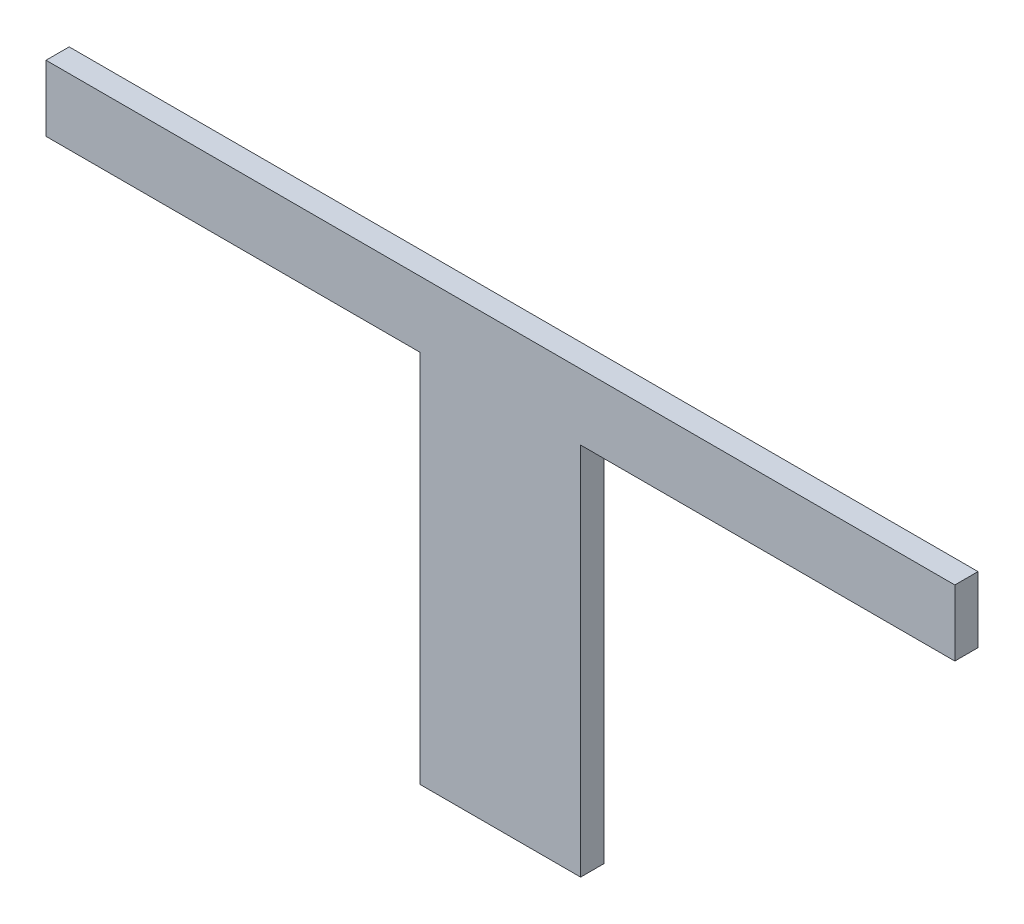
ISO-10303-21;
HEADER;
FILE_DESCRIPTION(('STEP AP214'),'2;1');
FILE_NAME('part.step','',(''),(''),'','','');
FILE_SCHEMA(('AUTOMOTIVE_DESIGN { 1 0 10303 214 1 1 1 1 }'));
ENDSEC;
DATA;
#1=APPLICATION_CONTEXT('core data for automotive mechanical design processes');
#2=APPLICATION_PROTOCOL_DEFINITION('international standard','automotive_design',2000,#1);
#3=PRODUCT_CONTEXT('',#1,'mechanical');
#4=PRODUCT('Part','Part','',(#3));
#5=PRODUCT_RELATED_PRODUCT_CATEGORY('part','',(#4));
#6=PRODUCT_DEFINITION_FORMATION('','',#4);
#7=PRODUCT_DEFINITION_CONTEXT('part definition',#1,'design');
#8=PRODUCT_DEFINITION('design','',#6,#7);
#9=PRODUCT_DEFINITION_SHAPE('','',#8);
#10=(LENGTH_UNIT() NAMED_UNIT(*) SI_UNIT(.MILLI.,.METRE.));
#11=(NAMED_UNIT(*) PLANE_ANGLE_UNIT() SI_UNIT($,.RADIAN.));
#12=(NAMED_UNIT(*) SI_UNIT($,.STERADIAN.) SOLID_ANGLE_UNIT());
#13=UNCERTAINTY_MEASURE_WITH_UNIT(LENGTH_MEASURE(1.E-05),#10,'distance_accuracy_value','');
#14=(GEOMETRIC_REPRESENTATION_CONTEXT(3) GLOBAL_UNCERTAINTY_ASSIGNED_CONTEXT((#13)) GLOBAL_UNIT_ASSIGNED_CONTEXT((#10,
#11,#12)) REPRESENTATION_CONTEXT('',''));
#15=CARTESIAN_POINT('',(0.,0.,0.));
#16=DIRECTION('',(0.,0.,1.));
#17=DIRECTION('',(1.,0.,0.));
#18=AXIS2_PLACEMENT_3D('',#15,#16,#17);
#19=CARTESIAN_POINT('',(1.73076923076924,-1.92307692307692,0.5));
#20=DIRECTION('',(0.,1.,0.));
#21=DIRECTION('',(0.,0.,1.));
#22=AXIS2_PLACEMENT_3D('',#19,#20,#21);
#23=PLANE('',#22);
#24=DIRECTION('',(1.,0.,0.));
#25=VECTOR('',#24,1.);
#26=CARTESIAN_POINT('',(1.73076923076924,-1.92307692307692,0.));
#27=LINE('',#26,#25);
#28=CARTESIAN_POINT('',(1.73076923076924,-1.92307692307692,0.));
#29=VERTEX_POINT('',#28);
#30=CARTESIAN_POINT('',(9.80769230769232,-1.92307692307692,0.));
#31=VERTEX_POINT('',#30);
#32=EDGE_CURVE('E135',#29,#31,#27,.T.);
#33=ORIENTED_EDGE('',*,*,#32,.T.);
#34=DIRECTION('',(0.,0.,-1.));
#35=VECTOR('',#34,1.);
#36=CARTESIAN_POINT('',(9.80769230769232,-1.92307692307692,0.5));
#37=LINE('',#36,#35);
#38=CARTESIAN_POINT('',(9.80769230769232,-1.92307692307692,0.5));
#39=VERTEX_POINT('',#38);
#40=EDGE_CURVE('E149',#39,#31,#37,.T.);
#41=ORIENTED_EDGE('',*,*,#40,.F.);
#42=DIRECTION('',(1.,0.,0.));
#43=VECTOR('',#42,1.);
#44=CARTESIAN_POINT('',(1.73076923076924,-1.92307692307692,0.5));
#45=LINE('',#44,#43);
#46=CARTESIAN_POINT('',(1.73076923076924,-1.92307692307692,0.5));
#47=VERTEX_POINT('',#46);
#48=EDGE_CURVE('E158',#47,#39,#45,.T.);
#49=ORIENTED_EDGE('',*,*,#48,.F.);
#50=DIRECTION('',(0.,0.,-1.));
#51=VECTOR('',#50,1.);
#52=CARTESIAN_POINT('',(1.73076923076924,-1.92307692307692,0.5));
#53=LINE('',#52,#51);
#54=EDGE_CURVE('E152',#47,#29,#53,.T.);
#55=ORIENTED_EDGE('',*,*,#54,.T.);
#56=EDGE_LOOP('',(#33,#41,#49,#55));
#57=FACE_BOUND('',#56,.T.);
#58=ADVANCED_FACE('F39',(#57),#23,.F.);
#59=CARTESIAN_POINT('',(1.73076923076924,-10.,0.5));
#60=DIRECTION('',(-1.,0.,0.));
#61=DIRECTION('',(0.,0.,1.));
#62=AXIS2_PLACEMENT_3D('',#59,#60,#61);
#63=PLANE('',#62);
#64=DIRECTION('',(0.,1.,0.));
#65=VECTOR('',#64,1.);
#66=CARTESIAN_POINT('',(1.73076923076924,-10.,0.));
#67=LINE('',#66,#65);
#68=CARTESIAN_POINT('',(1.73076923076924,-10.,0.));
#69=VERTEX_POINT('',#68);
#70=EDGE_CURVE('E129',#69,#29,#67,.T.);
#71=ORIENTED_EDGE('',*,*,#70,.T.);
#72=ORIENTED_EDGE('',*,*,#54,.F.);
#73=DIRECTION('',(0.,1.,0.));
#74=VECTOR('',#73,1.);
#75=CARTESIAN_POINT('',(1.73076923076924,-10.,0.5));
#76=LINE('',#75,#74);
#77=CARTESIAN_POINT('',(1.73076923076924,-10.,0.5));
#78=VERTEX_POINT('',#77);
#79=EDGE_CURVE('E160',#78,#47,#76,.T.);
#80=ORIENTED_EDGE('',*,*,#79,.F.);
#81=DIRECTION('',(0.,0.,-1.));
#82=VECTOR('',#81,1.);
#83=CARTESIAN_POINT('',(1.73076923076924,-10.,0.5));
#84=LINE('',#83,#82);
#85=EDGE_CURVE('E47',#78,#69,#84,.T.);
#86=ORIENTED_EDGE('',*,*,#85,.T.);
#87=EDGE_LOOP('',(#71,#72,#80,#86));
#88=FACE_BOUND('',#87,.T.);
#89=ADVANCED_FACE('F153',(#88),#63,.F.);
#90=CARTESIAN_POINT('',(-1.73076923076922,-10.,0.5));
#91=DIRECTION('',(0.,1.,0.));
#92=DIRECTION('',(0.,0.,1.));
#93=AXIS2_PLACEMENT_3D('',#90,#91,#92);
#94=PLANE('',#93);
#95=DIRECTION('',(1.,0.,0.));
#96=VECTOR('',#95,1.);
#97=CARTESIAN_POINT('',(-1.73076923076922,-10.,0.));
#98=LINE('',#97,#96);
#99=CARTESIAN_POINT('',(-1.73076923076922,-10.,0.));
#100=VERTEX_POINT('',#99);
#101=EDGE_CURVE('E121',#100,#69,#98,.T.);
#102=ORIENTED_EDGE('',*,*,#101,.T.);
#103=ORIENTED_EDGE('',*,*,#85,.F.);
#104=DIRECTION('',(1.,0.,0.));
#105=VECTOR('',#104,1.);
#106=CARTESIAN_POINT('',(-1.73076923076922,-10.,0.5));
#107=LINE('',#106,#105);
#108=CARTESIAN_POINT('',(-1.73076923076922,-10.,0.5));
#109=VERTEX_POINT('',#108);
#110=EDGE_CURVE('E120',#109,#78,#107,.T.);
#111=ORIENTED_EDGE('',*,*,#110,.F.);
#112=DIRECTION('',(0.,0.,-1.));
#113=VECTOR('',#112,1.);
#114=CARTESIAN_POINT('',(-1.73076923076922,-10.,0.5));
#115=LINE('',#114,#113);
#116=EDGE_CURVE('E111',#109,#100,#115,.T.);
#117=ORIENTED_EDGE('',*,*,#116,.T.);
#118=EDGE_LOOP('',(#102,#103,#111,#117));
#119=FACE_BOUND('',#118,.T.);
#120=ADVANCED_FACE('F41',(#119),#94,.F.);
#121=CARTESIAN_POINT('',(-1.73076923076922,-1.92307692307692,0.5));
#122=DIRECTION('',(1.,0.,0.));
#123=DIRECTION('',(0.,0.,-1.));
#124=AXIS2_PLACEMENT_3D('',#121,#122,#123);
#125=PLANE('',#124);
#126=DIRECTION('',(0.,-1.,0.));
#127=VECTOR('',#126,1.);
#128=CARTESIAN_POINT('',(-1.73076923076922,-1.92307692307692,0.));
#129=LINE('',#128,#127);
#130=CARTESIAN_POINT('',(-1.73076923076922,-1.92307692307692,0.));
#131=VERTEX_POINT('',#130);
#132=EDGE_CURVE('E106',#131,#100,#129,.T.);
#133=ORIENTED_EDGE('',*,*,#132,.T.);
#134=ORIENTED_EDGE('',*,*,#116,.F.);
#135=DIRECTION('',(0.,-1.,0.));
#136=VECTOR('',#135,1.);
#137=CARTESIAN_POINT('',(-1.73076923076922,-1.92307692307692,0.5));
#138=LINE('',#137,#136);
#139=CARTESIAN_POINT('',(-1.73076923076922,-1.92307692307692,0.5));
#140=VERTEX_POINT('',#139);
#141=EDGE_CURVE('E124',#140,#109,#138,.T.);
#142=ORIENTED_EDGE('',*,*,#141,.F.);
#143=DIRECTION('',(0.,0.,-1.));
#144=VECTOR('',#143,1.);
#145=CARTESIAN_POINT('',(-1.73076923076922,-1.92307692307692,0.5));
#146=LINE('',#145,#144);
#147=EDGE_CURVE('E113',#140,#131,#146,.T.);
#148=ORIENTED_EDGE('',*,*,#147,.T.);
#149=EDGE_LOOP('',(#133,#134,#142,#148));
#150=FACE_BOUND('',#149,.T.);
#151=ADVANCED_FACE('F112',(#150),#125,.F.);
#152=CARTESIAN_POINT('',(-9.8076923076923,-1.92307692307692,0.5));
#153=DIRECTION('',(0.,1.,0.));
#154=DIRECTION('',(0.,0.,1.));
#155=AXIS2_PLACEMENT_3D('',#152,#153,#154);
#156=PLANE('',#155);
#157=DIRECTION('',(1.,0.,0.));
#158=VECTOR('',#157,1.);
#159=CARTESIAN_POINT('',(-9.8076923076923,-1.92307692307692,0.));
#160=LINE('',#159,#158);
#161=CARTESIAN_POINT('',(-9.8076923076923,-1.92307692307692,0.));
#162=VERTEX_POINT('',#161);
#163=EDGE_CURVE('E104',#162,#131,#160,.T.);
#164=ORIENTED_EDGE('',*,*,#163,.T.);
#165=ORIENTED_EDGE('',*,*,#147,.F.);
#166=DIRECTION('',(1.,0.,0.));
#167=VECTOR('',#166,1.);
#168=CARTESIAN_POINT('',(-9.8076923076923,-1.92307692307692,0.5));
#169=LINE('',#168,#167);
#170=CARTESIAN_POINT('',(-9.8076923076923,-1.92307692307692,0.5));
#171=VERTEX_POINT('',#170);
#172=EDGE_CURVE('E173',#171,#140,#169,.T.);
#173=ORIENTED_EDGE('',*,*,#172,.F.);
#174=DIRECTION('',(0.,0.,-1.));
#175=VECTOR('',#174,1.);
#176=CARTESIAN_POINT('',(-9.8076923076923,-1.92307692307692,0.5));
#177=LINE('',#176,#175);
#178=EDGE_CURVE('E147',#171,#162,#177,.T.);
#179=ORIENTED_EDGE('',*,*,#178,.T.);
#180=EDGE_LOOP('',(#164,#165,#173,#179));
#181=FACE_BOUND('',#180,.T.);
#182=ADVANCED_FACE('F172',(#181),#156,.F.);
#183=CARTESIAN_POINT('',(0.,0.,0.5));
#184=DIRECTION('',(0.,0.,1.));
#185=DIRECTION('',(1.,0.,0.));
#186=AXIS2_PLACEMENT_3D('',#183,#184,#185);
#187=PLANE('',#186);
#188=DIRECTION('',(1.,0.,0.));
#189=VECTOR('',#188,1.);
#190=CARTESIAN_POINT('',(0.,-0.5,0.5));
#191=LINE('',#190,#189);
#192=CARTESIAN_POINT('',(-9.8076923076923,-0.5,0.5));
#193=VERTEX_POINT('',#192);
#194=CARTESIAN_POINT('',(9.80769230769232,-0.5,0.5));
#195=VERTEX_POINT('',#194);
#196=EDGE_CURVE('E11',#193,#195,#191,.T.);
#197=ORIENTED_EDGE('',*,*,#196,.F.);
#198=DIRECTION('',(0.,-1.,0.));
#199=VECTOR('',#198,1.);
#200=CARTESIAN_POINT('',(-9.8076923076923,1.53846153846154,0.5));
#201=LINE('',#200,#199);
#202=EDGE_CURVE('E169',#193,#171,#201,.T.);
#203=ORIENTED_EDGE('',*,*,#202,.T.);
#204=ORIENTED_EDGE('',*,*,#172,.T.);
#205=ORIENTED_EDGE('',*,*,#141,.T.);
#206=ORIENTED_EDGE('',*,*,#110,.T.);
#207=ORIENTED_EDGE('',*,*,#79,.T.);
#208=ORIENTED_EDGE('',*,*,#48,.T.);
#209=DIRECTION('',(0.,1.,0.));
#210=VECTOR('',#209,1.);
#211=CARTESIAN_POINT('',(9.80769230769232,-1.92307692307692,0.5));
#212=LINE('',#211,#210);
#213=EDGE_CURVE('E167',#39,#195,#212,.T.);
#214=ORIENTED_EDGE('',*,*,#213,.T.);
#215=EDGE_LOOP('',(#197,#203,#204,#205,#206,#207,#208,#214));
#216=FACE_BOUND('',#215,.T.);
#217=ADVANCED_FACE('F164',(#216),#187,.T.);
#218=CARTESIAN_POINT('',(-9.8076923076923,1.53846153846154,0.5));
#219=DIRECTION('',(1.,0.,0.));
#220=DIRECTION('',(0.,0.,-1.));
#221=AXIS2_PLACEMENT_3D('',#218,#219,#220);
#222=PLANE('',#221);
#223=ORIENTED_EDGE('',*,*,#202,.F.);
#224=DIRECTION('',(0.,0.,-1.));
#225=VECTOR('',#224,1.);
#226=CARTESIAN_POINT('',(-9.8076923076923,-0.5,0.5));
#227=LINE('',#226,#225);
#228=CARTESIAN_POINT('',(-9.8076923076923,-0.5,0.));
#229=VERTEX_POINT('',#228);
#230=EDGE_CURVE('E57',#193,#229,#227,.T.);
#231=ORIENTED_EDGE('',*,*,#230,.T.);
#232=DIRECTION('',(0.,-1.,0.));
#233=VECTOR('',#232,1.);
#234=CARTESIAN_POINT('',(-9.8076923076923,1.53846153846154,0.));
#235=LINE('',#234,#233);
#236=EDGE_CURVE('E145',#229,#162,#235,.T.);
#237=ORIENTED_EDGE('',*,*,#236,.T.);
#238=ORIENTED_EDGE('',*,*,#178,.F.);
#239=EDGE_LOOP('',(#223,#231,#237,#238));
#240=FACE_BOUND('',#239,.T.);
#241=ADVANCED_FACE('F182',(#240),#222,.F.);
#242=CARTESIAN_POINT('',(9.80769230769232,-1.92307692307692,0.5));
#243=DIRECTION('',(-1.,0.,0.));
#244=DIRECTION('',(0.,0.,1.));
#245=AXIS2_PLACEMENT_3D('',#242,#243,#244);
#246=PLANE('',#245);
#247=DIRECTION('',(0.,1.,0.));
#248=VECTOR('',#247,1.);
#249=CARTESIAN_POINT('',(9.80769230769232,-1.92307692307692,0.));
#250=LINE('',#249,#248);
#251=CARTESIAN_POINT('',(9.80769230769232,-0.5,0.));
#252=VERTEX_POINT('',#251);
#253=EDGE_CURVE('E137',#31,#252,#250,.T.);
#254=ORIENTED_EDGE('',*,*,#253,.T.);
#255=DIRECTION('',(0.,0.,1.));
#256=VECTOR('',#255,1.);
#257=CARTESIAN_POINT('',(9.80769230769232,-0.5,0.5));
#258=LINE('',#257,#256);
#259=EDGE_CURVE('E70',#252,#195,#258,.T.);
#260=ORIENTED_EDGE('',*,*,#259,.T.);
#261=ORIENTED_EDGE('',*,*,#213,.F.);
#262=ORIENTED_EDGE('',*,*,#40,.T.);
#263=EDGE_LOOP('',(#254,#260,#261,#262));
#264=FACE_BOUND('',#263,.T.);
#265=ADVANCED_FACE('F197',(#264),#246,.F.);
#266=CARTESIAN_POINT('',(0.,0.,0.));
#267=DIRECTION('',(0.,0.,1.));
#268=DIRECTION('',(1.,0.,0.));
#269=AXIS2_PLACEMENT_3D('',#266,#267,#268);
#270=PLANE('',#269);
#271=DIRECTION('',(-1.,0.,0.));
#272=VECTOR('',#271,1.);
#273=CARTESIAN_POINT('',(-17.,-0.5,0.));
#274=LINE('',#273,#272);
#275=EDGE_CURVE('E43',#252,#229,#274,.T.);
#276=ORIENTED_EDGE('',*,*,#275,.F.);
#277=ORIENTED_EDGE('',*,*,#253,.F.);
#278=ORIENTED_EDGE('',*,*,#32,.F.);
#279=ORIENTED_EDGE('',*,*,#70,.F.);
#280=ORIENTED_EDGE('',*,*,#101,.F.);
#281=ORIENTED_EDGE('',*,*,#132,.F.);
#282=ORIENTED_EDGE('',*,*,#163,.F.);
#283=ORIENTED_EDGE('',*,*,#236,.F.);
#284=EDGE_LOOP('',(#276,#277,#278,#279,#280,#281,#282,#283));
#285=FACE_BOUND('',#284,.T.);
#286=ADVANCED_FACE('F130',(#285),#270,.F.);
#287=CARTESIAN_POINT('',(-17.,-0.5,1.));
#288=DIRECTION('',(0.,-1.,0.));
#289=DIRECTION('',(0.,0.,-1.));
#290=AXIS2_PLACEMENT_3D('',#287,#288,#289);
#291=PLANE('',#290);
#292=ORIENTED_EDGE('',*,*,#275,.T.);
#293=ORIENTED_EDGE('',*,*,#230,.F.);
#294=ORIENTED_EDGE('',*,*,#196,.T.);
#295=ORIENTED_EDGE('',*,*,#259,.F.);
#296=EDGE_LOOP('',(#292,#293,#294,#295));
#297=FACE_BOUND('',#296,.T.);
#298=ADVANCED_FACE('F224',(#297),#291,.F.);
#299=CLOSED_SHELL('',(#58,#89,#120,#151,#182,#217,#241,#265,#286,#298));
#300=MANIFOLD_SOLID_BREP('B2',#299);
#301=ADVANCED_BREP_SHAPE_REPRESENTATION('',(#18,#300),#14);
#302=SHAPE_DEFINITION_REPRESENTATION(#9,#301);
ENDSEC;
END-ISO-10303-21;
